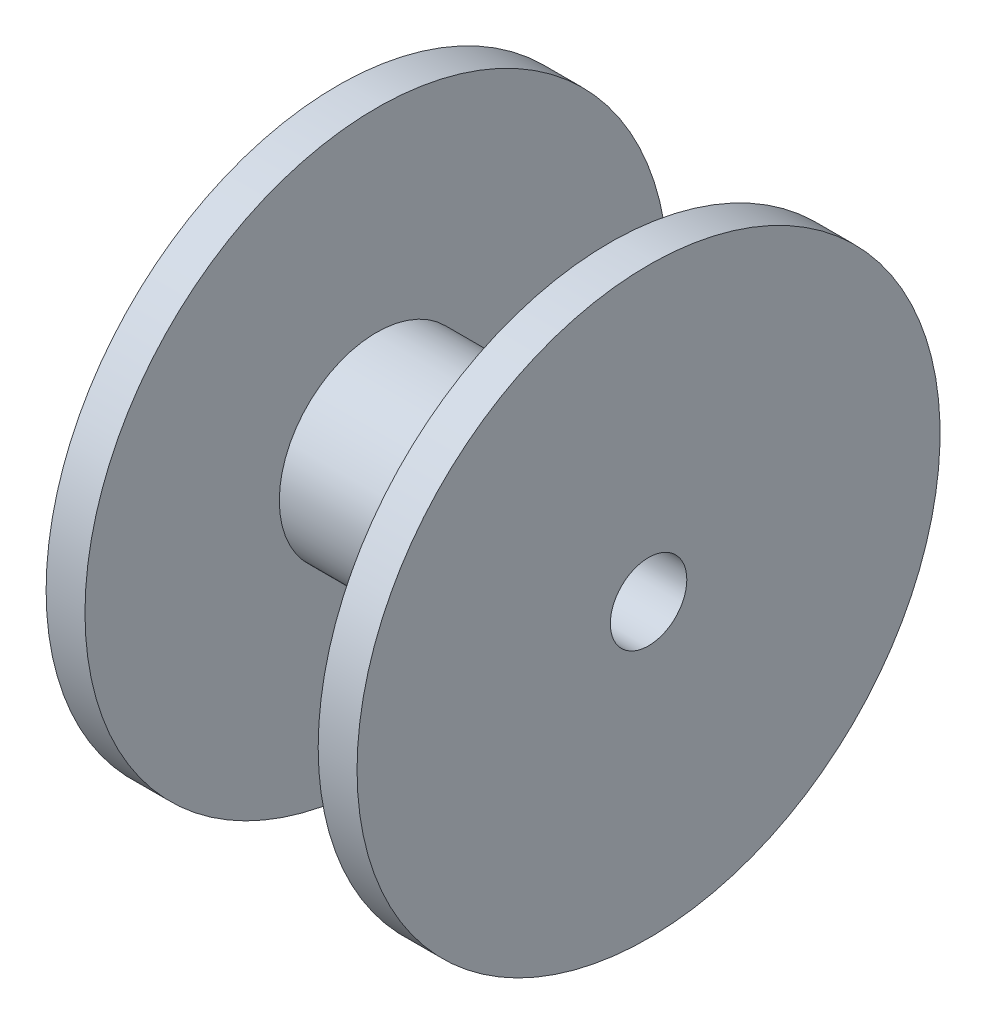
ISO-10303-21;
HEADER;
FILE_DESCRIPTION(('STEP AP214'),'2;1');
FILE_NAME('part.step','',(''),(''),'','','');
FILE_SCHEMA(('AUTOMOTIVE_DESIGN { 1 0 10303 214 1 1 1 1 }'));
ENDSEC;
DATA;
#1=APPLICATION_CONTEXT('core data for automotive mechanical design processes');
#2=APPLICATION_PROTOCOL_DEFINITION('international standard','automotive_design',2000,#1);
#3=PRODUCT_CONTEXT('',#1,'mechanical');
#4=PRODUCT('Part','Part','',(#3));
#5=PRODUCT_RELATED_PRODUCT_CATEGORY('part','',(#4));
#6=PRODUCT_DEFINITION_FORMATION('','',#4);
#7=PRODUCT_DEFINITION_CONTEXT('part definition',#1,'design');
#8=PRODUCT_DEFINITION('design','',#6,#7);
#9=PRODUCT_DEFINITION_SHAPE('','',#8);
#10=(LENGTH_UNIT() NAMED_UNIT(*) SI_UNIT(.MILLI.,.METRE.));
#11=(NAMED_UNIT(*) PLANE_ANGLE_UNIT() SI_UNIT($,.RADIAN.));
#12=(NAMED_UNIT(*) SI_UNIT($,.STERADIAN.) SOLID_ANGLE_UNIT());
#13=UNCERTAINTY_MEASURE_WITH_UNIT(LENGTH_MEASURE(1.E-05),#10,'distance_accuracy_value','');
#14=(GEOMETRIC_REPRESENTATION_CONTEXT(3) GLOBAL_UNCERTAINTY_ASSIGNED_CONTEXT((#13)) GLOBAL_UNIT_ASSIGNED_CONTEXT((#10,
#11,#12)) REPRESENTATION_CONTEXT('',''));
#15=CARTESIAN_POINT('',(0.,0.,0.));
#16=DIRECTION('',(0.,0.,1.));
#17=DIRECTION('',(1.,0.,0.));
#18=AXIS2_PLACEMENT_3D('',#15,#16,#17);
#19=CARTESIAN_POINT('',(0.,0.,0.));
#20=DIRECTION('',(-1.,0.,0.));
#21=DIRECTION('',(0.,0.,1.));
#22=AXIS2_PLACEMENT_3D('',#19,#20,#21);
#23=PLANE('',#22);
#24=CARTESIAN_POINT('',(0.,0.,0.));
#25=DIRECTION('',(1.,0.,0.));
#26=DIRECTION('',(0.,0.,-1.));
#27=AXIS2_PLACEMENT_3D('',#24,#25,#26);
#28=CIRCLE('',#27,5.);
#29=CARTESIAN_POINT('',(0.,0.,-5.));
#30=VERTEX_POINT('',#29);
#31=EDGE_CURVE('E58',#30,#30,#28,.T.);
#32=ORIENTED_EDGE('',*,*,#31,.T.);
#33=EDGE_LOOP('',(#32));
#34=FACE_BOUND('',#33,.T.);
#35=CARTESIAN_POINT('',(0.,0.,0.));
#36=DIRECTION('',(-1.,0.,0.));
#37=DIRECTION('',(0.,0.,1.));
#38=AXIS2_PLACEMENT_3D('',#35,#36,#37);
#39=CIRCLE('',#38,38.1);
#40=CARTESIAN_POINT('',(0.,0.,38.1));
#41=VERTEX_POINT('',#40);
#42=EDGE_CURVE('E55',#41,#41,#39,.T.);
#43=ORIENTED_EDGE('',*,*,#42,.T.);
#44=EDGE_LOOP('',(#43));
#45=FACE_BOUND('',#44,.T.);
#46=ADVANCED_FACE('F33',(#34,#45),#23,.T.);
#47=CARTESIAN_POINT('',(40.64,-38.1,0.));
#48=DIRECTION('',(1.,0.,0.));
#49=DIRECTION('',(0.,0.,-1.));
#50=AXIS2_PLACEMENT_3D('',#47,#48,#49);
#51=PLANE('',#50);
#52=CARTESIAN_POINT('',(40.64,0.,0.));
#53=DIRECTION('',(1.,0.,0.));
#54=DIRECTION('',(0.,0.,-1.));
#55=AXIS2_PLACEMENT_3D('',#52,#53,#54);
#56=CIRCLE('',#55,5.);
#57=CARTESIAN_POINT('',(40.64,0.,-5.));
#58=VERTEX_POINT('',#57);
#59=EDGE_CURVE('E59',#58,#58,#56,.T.);
#60=ORIENTED_EDGE('',*,*,#59,.F.);
#61=EDGE_LOOP('',(#60));
#62=FACE_BOUND('',#61,.T.);
#63=CARTESIAN_POINT('',(40.64,0.,0.));
#64=DIRECTION('',(-1.,0.,0.));
#65=DIRECTION('',(0.,0.,1.));
#66=AXIS2_PLACEMENT_3D('',#63,#64,#65);
#67=CIRCLE('',#66,38.1);
#68=CARTESIAN_POINT('',(40.64,0.,38.1));
#69=VERTEX_POINT('',#68);
#70=EDGE_CURVE('E10',#69,#69,#67,.T.);
#71=ORIENTED_EDGE('',*,*,#70,.F.);
#72=EDGE_LOOP('',(#71));
#73=FACE_BOUND('',#72,.T.);
#74=ADVANCED_FACE('F74',(#62,#73),#51,.T.);
#75=CARTESIAN_POINT('',(0.,0.,0.));
#76=DIRECTION('',(-1.,0.,0.));
#77=DIRECTION('',(0.,0.,1.));
#78=AXIS2_PLACEMENT_3D('',#75,#76,#77);
#79=CYLINDRICAL_SURFACE('',#78,38.1);
#80=ORIENTED_EDGE('',*,*,#70,.T.);
#81=EDGE_LOOP('',(#80));
#82=FACE_BOUND('',#81,.T.);
#83=CARTESIAN_POINT('',(35.56,0.,0.));
#84=DIRECTION('',(-1.,0.,0.));
#85=DIRECTION('',(0.,0.,1.));
#86=AXIS2_PLACEMENT_3D('',#83,#84,#85);
#87=CIRCLE('',#86,38.1);
#88=CARTESIAN_POINT('',(35.56,0.,38.1));
#89=VERTEX_POINT('',#88);
#90=EDGE_CURVE('E39',#89,#89,#87,.T.);
#91=ORIENTED_EDGE('',*,*,#90,.F.);
#92=EDGE_LOOP('',(#91));
#93=FACE_BOUND('',#92,.T.);
#94=ADVANCED_FACE('F77',(#82,#93),#79,.T.);
#95=CARTESIAN_POINT('',(35.56,-12.7,0.));
#96=DIRECTION('',(-1.,0.,0.));
#97=DIRECTION('',(0.,0.,1.));
#98=AXIS2_PLACEMENT_3D('',#95,#96,#97);
#99=PLANE('',#98);
#100=ORIENTED_EDGE('',*,*,#90,.T.);
#101=EDGE_LOOP('',(#100));
#102=FACE_BOUND('',#101,.T.);
#103=CARTESIAN_POINT('',(35.56,0.,0.));
#104=DIRECTION('',(-1.,0.,0.));
#105=DIRECTION('',(0.,0.,1.));
#106=AXIS2_PLACEMENT_3D('',#103,#104,#105);
#107=CIRCLE('',#106,12.7);
#108=CARTESIAN_POINT('',(35.56,0.,12.7));
#109=VERTEX_POINT('',#108);
#110=EDGE_CURVE('E43',#109,#109,#107,.T.);
#111=ORIENTED_EDGE('',*,*,#110,.F.);
#112=EDGE_LOOP('',(#111));
#113=FACE_BOUND('',#112,.T.);
#114=ADVANCED_FACE('F82',(#102,#113),#99,.T.);
#115=CARTESIAN_POINT('',(0.,0.,0.));
#116=DIRECTION('',(-1.,0.,0.));
#117=DIRECTION('',(0.,0.,1.));
#118=AXIS2_PLACEMENT_3D('',#115,#116,#117);
#119=CYLINDRICAL_SURFACE('',#118,12.7);
#120=ORIENTED_EDGE('',*,*,#110,.T.);
#121=EDGE_LOOP('',(#120));
#122=FACE_BOUND('',#121,.T.);
#123=CARTESIAN_POINT('',(5.08,0.,0.));
#124=DIRECTION('',(-1.,0.,0.));
#125=DIRECTION('',(0.,0.,1.));
#126=AXIS2_PLACEMENT_3D('',#123,#124,#125);
#127=CIRCLE('',#126,12.7);
#128=CARTESIAN_POINT('',(5.08,0.,12.7));
#129=VERTEX_POINT('',#128);
#130=EDGE_CURVE('E47',#129,#129,#127,.T.);
#131=ORIENTED_EDGE('',*,*,#130,.F.);
#132=EDGE_LOOP('',(#131));
#133=FACE_BOUND('',#132,.T.);
#134=ADVANCED_FACE('F87',(#122,#133),#119,.T.);
#135=CARTESIAN_POINT('',(5.08,-38.1,0.));
#136=DIRECTION('',(1.,0.,0.));
#137=DIRECTION('',(0.,0.,-1.));
#138=AXIS2_PLACEMENT_3D('',#135,#136,#137);
#139=PLANE('',#138);
#140=ORIENTED_EDGE('',*,*,#130,.T.);
#141=EDGE_LOOP('',(#140));
#142=FACE_BOUND('',#141,.T.);
#143=CARTESIAN_POINT('',(5.08,0.,0.));
#144=DIRECTION('',(-1.,0.,0.));
#145=DIRECTION('',(0.,0.,1.));
#146=AXIS2_PLACEMENT_3D('',#143,#144,#145);
#147=CIRCLE('',#146,38.1);
#148=CARTESIAN_POINT('',(5.08,0.,38.1));
#149=VERTEX_POINT('',#148);
#150=EDGE_CURVE('E52',#149,#149,#147,.T.);
#151=ORIENTED_EDGE('',*,*,#150,.F.);
#152=EDGE_LOOP('',(#151));
#153=FACE_BOUND('',#152,.T.);
#154=ADVANCED_FACE('F90',(#142,#153),#139,.T.);
#155=CARTESIAN_POINT('',(0.,0.,0.));
#156=DIRECTION('',(-1.,0.,0.));
#157=DIRECTION('',(0.,0.,1.));
#158=AXIS2_PLACEMENT_3D('',#155,#156,#157);
#159=CYLINDRICAL_SURFACE('',#158,38.1);
#160=ORIENTED_EDGE('',*,*,#150,.T.);
#161=EDGE_LOOP('',(#160));
#162=FACE_BOUND('',#161,.T.);
#163=ORIENTED_EDGE('',*,*,#42,.F.);
#164=EDGE_LOOP('',(#163));
#165=FACE_BOUND('',#164,.T.);
#166=ADVANCED_FACE('F70',(#162,#165),#159,.T.);
#167=CARTESIAN_POINT('',(0.,0.,0.));
#168=DIRECTION('',(1.,0.,0.));
#169=DIRECTION('',(0.,0.,-1.));
#170=AXIS2_PLACEMENT_3D('',#167,#168,#169);
#171=CYLINDRICAL_SURFACE('',#170,5.);
#172=ORIENTED_EDGE('',*,*,#31,.F.);
#173=EDGE_LOOP('',(#172));
#174=FACE_BOUND('',#173,.T.);
#175=ORIENTED_EDGE('',*,*,#59,.T.);
#176=EDGE_LOOP('',(#175));
#177=FACE_BOUND('',#176,.T.);
#178=ADVANCED_FACE('F67',(#174,#177),#171,.F.);
#179=CLOSED_SHELL('',(#46,#74,#94,#114,#134,#154,#166,#178));
#180=MANIFOLD_SOLID_BREP('B2',#179);
#181=ADVANCED_BREP_SHAPE_REPRESENTATION('',(#18,#180),#14);
#182=SHAPE_DEFINITION_REPRESENTATION(#9,#181);
ENDSEC;
END-ISO-10303-21;
